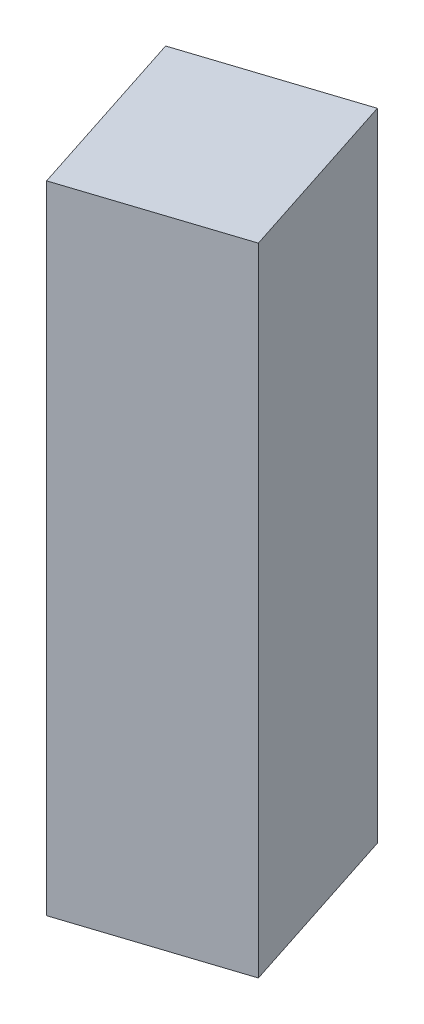
ISO-10303-21;
HEADER;
FILE_DESCRIPTION(('STEP AP214'),'2;1');
FILE_NAME('part.step','',(''),(''),'','','');
FILE_SCHEMA(('AUTOMOTIVE_DESIGN { 1 0 10303 214 1 1 1 1 }'));
ENDSEC;
DATA;
#1=APPLICATION_CONTEXT('core data for automotive mechanical design processes');
#2=APPLICATION_PROTOCOL_DEFINITION('international standard','automotive_design',2000,#1);
#3=PRODUCT_CONTEXT('',#1,'mechanical');
#4=PRODUCT('Part','Part','',(#3));
#5=PRODUCT_RELATED_PRODUCT_CATEGORY('part','',(#4));
#6=PRODUCT_DEFINITION_FORMATION('','',#4);
#7=PRODUCT_DEFINITION_CONTEXT('part definition',#1,'design');
#8=PRODUCT_DEFINITION('design','',#6,#7);
#9=PRODUCT_DEFINITION_SHAPE('','',#8);
#10=(LENGTH_UNIT() NAMED_UNIT(*) SI_UNIT(.MILLI.,.METRE.));
#11=(NAMED_UNIT(*) PLANE_ANGLE_UNIT() SI_UNIT($,.RADIAN.));
#12=(NAMED_UNIT(*) SI_UNIT($,.STERADIAN.) SOLID_ANGLE_UNIT());
#13=UNCERTAINTY_MEASURE_WITH_UNIT(LENGTH_MEASURE(1.E-05),#10,'distance_accuracy_value','');
#14=(GEOMETRIC_REPRESENTATION_CONTEXT(3) GLOBAL_UNCERTAINTY_ASSIGNED_CONTEXT((#13)) GLOBAL_UNIT_ASSIGNED_CONTEXT((#10,
#11,#12)) REPRESENTATION_CONTEXT('',''));
#15=CARTESIAN_POINT('',(0.,0.,0.));
#16=DIRECTION('',(0.,0.,1.));
#17=DIRECTION('',(1.,0.,0.));
#18=AXIS2_PLACEMENT_3D('',#15,#16,#17);
#19=CARTESIAN_POINT('',(104.6367512798,41.8789091554,74.8647731302));
#20=DIRECTION('',(0.30901700286401,0.,0.95105651353689));
#21=DIRECTION('',(0.95105651353689,0.,-0.30901700286401));
#22=AXIS2_PLACEMENT_3D('',#19,#20,#21);
#23=PLANE('',#22);
#24=DIRECTION('',(-0.95105651353689,0.,0.30901700286401));
#25=VECTOR('',#24,1.);
#26=CARTESIAN_POINT('',(105.2599724489,46.8419278552,74.6622762911));
#27=LINE('',#26,#25);
#28=CARTESIAN_POINT('',(105.883193618,46.8419278552,74.459779452));
#29=VERTEX_POINT('',#28);
#30=CARTESIAN_POINT('',(104.6367512798,46.8419278552,74.8647731302));
#31=VERTEX_POINT('',#30);
#32=EDGE_CURVE('E61',#29,#31,#27,.T.);
#33=ORIENTED_EDGE('',*,*,#32,.T.);
#34=DIRECTION('',(0.,1.,0.));
#35=VECTOR('',#34,1.);
#36=CARTESIAN_POINT('',(104.6367512798,44.3604185053,74.8647731302));
#37=LINE('',#36,#35);
#38=CARTESIAN_POINT('',(104.636751278863,41.8789091554,74.8647731296455));
#39=VERTEX_POINT('',#38);
#40=EDGE_CURVE('E81',#39,#31,#37,.T.);
#41=ORIENTED_EDGE('',*,*,#40,.F.);
#42=DIRECTION('',(0.95105651353689,0.,-0.30901700286401));
#43=VECTOR('',#42,1.);
#44=CARTESIAN_POINT('',(105.2599724489,41.8789091554,74.6622762911));
#45=LINE('',#44,#43);
#46=CARTESIAN_POINT('',(105.883193624052,41.8789091554,74.4597794551463));
#47=VERTEX_POINT('',#46);
#48=EDGE_CURVE('E84',#39,#47,#45,.T.);
#49=ORIENTED_EDGE('',*,*,#48,.T.);
#50=DIRECTION('',(0.,-1.,0.));
#51=VECTOR('',#50,1.);
#52=CARTESIAN_POINT('',(105.883193618,44.3604185053,74.459779452));
#53=LINE('',#52,#51);
#54=EDGE_CURVE('E65',#29,#47,#53,.T.);
#55=ORIENTED_EDGE('',*,*,#54,.F.);
#56=EDGE_LOOP('',(#33,#41,#49,#55));
#57=FACE_BOUND('',#56,.T.);
#58=ADVANCED_FACE('F17',(#57),#23,.T.);
#59=CARTESIAN_POINT('',(104.1900952516,41.8789091554,73.490107274));
#60=DIRECTION('',(-0.951056513086279,0.,0.309017004250846));
#61=DIRECTION('',(0.309017004250846,0.,0.951056513086279));
#62=AXIS2_PLACEMENT_3D('',#59,#60,#61);
#63=PLANE('',#62);
#64=DIRECTION('',(-0.309017004250846,0.,-0.951056513086279));
#65=VECTOR('',#64,1.);
#66=CARTESIAN_POINT('',(104.4134232657,46.8419278552,74.1774402021));
#67=LINE('',#66,#65);
#68=CARTESIAN_POINT('',(104.1900952516,46.8419278552,73.490107274));
#69=VERTEX_POINT('',#68);
#70=EDGE_CURVE('E78',#31,#69,#67,.T.);
#71=ORIENTED_EDGE('',*,*,#70,.T.);
#72=DIRECTION('',(0.,1.,0.));
#73=VECTOR('',#72,1.);
#74=CARTESIAN_POINT('',(104.1900952516,44.3604185053,73.490107274));
#75=LINE('',#74,#73);
#76=CARTESIAN_POINT('',(104.190095251172,41.8789091554,73.4901072726818));
#77=VERTEX_POINT('',#76);
#78=EDGE_CURVE('E73',#77,#69,#75,.T.);
#79=ORIENTED_EDGE('',*,*,#78,.F.);
#80=DIRECTION('',(0.309017004250846,0.,0.951056513086279));
#81=VECTOR('',#80,1.);
#82=CARTESIAN_POINT('',(104.4134232657,41.8789091554,74.1774402021));
#83=LINE('',#82,#81);
#84=EDGE_CURVE('E31',#77,#39,#83,.T.);
#85=ORIENTED_EDGE('',*,*,#84,.T.);
#86=ORIENTED_EDGE('',*,*,#40,.T.);
#87=EDGE_LOOP('',(#71,#79,#85,#86));
#88=FACE_BOUND('',#87,.T.);
#89=ADVANCED_FACE('F89',(#88),#63,.T.);
#90=CARTESIAN_POINT('',(105.883193618,46.8419278552,74.459779452));
#91=DIRECTION('',(0.,-1.,0.));
#92=DIRECTION('',(-0.95105651353689,0.,0.30901700286401));
#93=AXIS2_PLACEMENT_3D('',#90,#91,#92);
#94=PLANE('',#93);
#95=ORIENTED_EDGE('',*,*,#32,.F.);
#96=DIRECTION('',(0.309016988356027,0.,0.951056518250819));
#97=VECTOR('',#96,1.);
#98=CARTESIAN_POINT('',(105.6598656166,46.8419278552,73.7724465239));
#99=LINE('',#98,#97);
#100=CARTESIAN_POINT('',(105.4365376152,46.8419278552,73.0851135958));
#101=VERTEX_POINT('',#100);
#102=EDGE_CURVE('E54',#101,#29,#99,.T.);
#103=ORIENTED_EDGE('',*,*,#102,.F.);
#104=DIRECTION('',(0.951056515387576,0.,-0.309016997168186));
#105=VECTOR('',#104,1.);
#106=CARTESIAN_POINT('',(104.8133164334,46.8419278552,73.2876104349));
#107=LINE('',#106,#105);
#108=EDGE_CURVE('E59',#69,#101,#107,.T.);
#109=ORIENTED_EDGE('',*,*,#108,.F.);
#110=ORIENTED_EDGE('',*,*,#70,.F.);
#111=EDGE_LOOP('',(#95,#103,#109,#110));
#112=FACE_BOUND('',#111,.T.);
#113=ADVANCED_FACE('F56',(#112),#94,.F.);
#114=CARTESIAN_POINT('',(105.883193618,41.8789091554,74.459779452));
#115=DIRECTION('',(0.951056518250819,0.,-0.309016988356027));
#116=DIRECTION('',(-0.309016988356027,0.,-0.951056518250819));
#117=AXIS2_PLACEMENT_3D('',#114,#115,#116);
#118=PLANE('',#117);
#119=ORIENTED_EDGE('',*,*,#102,.T.);
#120=ORIENTED_EDGE('',*,*,#54,.T.);
#121=DIRECTION('',(-0.309016988356027,0.,-0.951056518250819));
#122=VECTOR('',#121,1.);
#123=CARTESIAN_POINT('',(105.6598656166,41.8789091554,73.7724465239));
#124=LINE('',#123,#122);
#125=CARTESIAN_POINT('',(105.436537615452,41.8789091554,73.0851135965768));
#126=VERTEX_POINT('',#125);
#127=EDGE_CURVE('E66',#47,#126,#124,.T.);
#128=ORIENTED_EDGE('',*,*,#127,.T.);
#129=DIRECTION('',(0.,-1.,0.));
#130=VECTOR('',#129,1.);
#131=CARTESIAN_POINT('',(105.4365376152,44.3604185053,73.0851135958));
#132=LINE('',#131,#130);
#133=EDGE_CURVE('E26',#101,#126,#132,.T.);
#134=ORIENTED_EDGE('',*,*,#133,.F.);
#135=EDGE_LOOP('',(#119,#120,#128,#134));
#136=FACE_BOUND('',#135,.T.);
#137=ADVANCED_FACE('F69',(#136),#118,.T.);
#138=CARTESIAN_POINT('',(105.4365376152,41.8789091554,73.0851135958));
#139=DIRECTION('',(-0.309016997168186,0.,-0.951056515387575));
#140=DIRECTION('',(-0.951056515387575,0.,0.309016997168186));
#141=AXIS2_PLACEMENT_3D('',#138,#139,#140);
#142=PLANE('',#141);
#143=ORIENTED_EDGE('',*,*,#108,.T.);
#144=ORIENTED_EDGE('',*,*,#133,.T.);
#145=DIRECTION('',(0.951056516426363,0.,-0.309016993971127));
#146=VECTOR('',#145,1.);
#147=CARTESIAN_POINT('',(104.19009526462,41.8789091554,73.4901072668549));
#148=LINE('',#147,#146);
#149=EDGE_CURVE('E11',#77,#126,#148,.T.);
#150=ORIENTED_EDGE('',*,*,#149,.F.);
#151=ORIENTED_EDGE('',*,*,#78,.T.);
#152=EDGE_LOOP('',(#143,#144,#150,#151));
#153=FACE_BOUND('',#152,.T.);
#154=ADVANCED_FACE('F72',(#153),#142,.T.);
#155=CARTESIAN_POINT('',(104.179936674,41.8789091554,74.875451087));
#156=DIRECTION('',(0.,-1.,0.));
#157=DIRECTION('',(0.,0.,-1.));
#158=AXIS2_PLACEMENT_3D('',#155,#156,#157);
#159=PLANE('',#158);
#160=ORIENTED_EDGE('',*,*,#84,.F.);
#161=ORIENTED_EDGE('',*,*,#149,.T.);
#162=ORIENTED_EDGE('',*,*,#127,.F.);
#163=ORIENTED_EDGE('',*,*,#48,.F.);
#164=EDGE_LOOP('',(#160,#161,#162,#163));
#165=FACE_BOUND('',#164,.T.);
#166=ADVANCED_FACE('F19',(#165),#159,.T.);
#167=CLOSED_SHELL('',(#58,#89,#113,#137,#154,#166));
#168=MANIFOLD_SOLID_BREP('B1',#167);
#169=ADVANCED_BREP_SHAPE_REPRESENTATION('',(#18,#168),#14);
#170=SHAPE_DEFINITION_REPRESENTATION(#9,#169);
ENDSEC;
END-ISO-10303-21;
